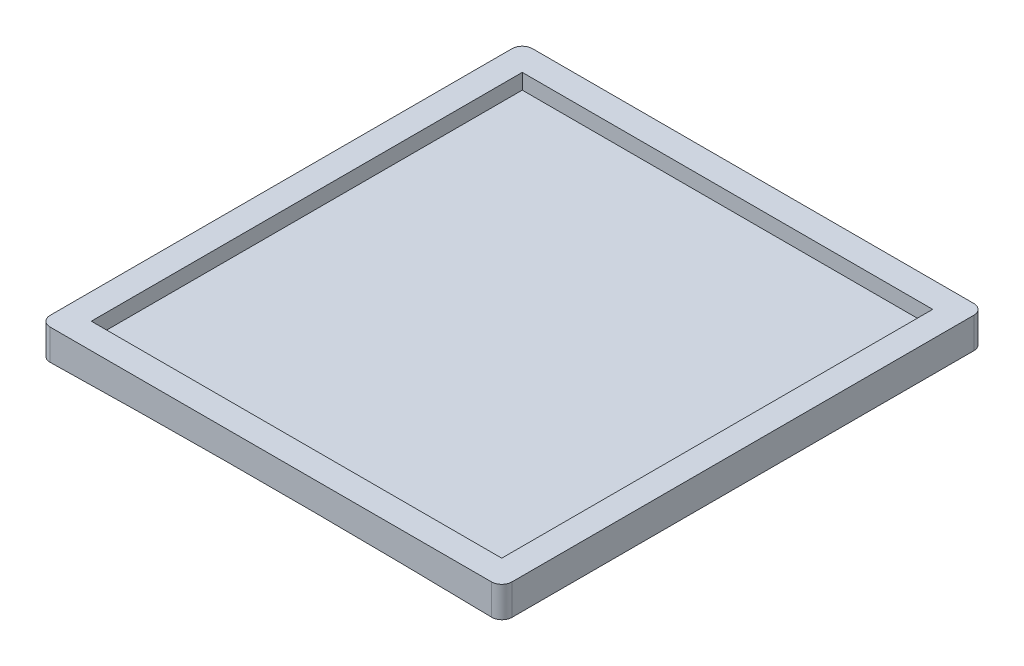
ISO-10303-21;
HEADER;
FILE_DESCRIPTION(('STEP AP214'),'2;1');
FILE_NAME('part.step','',(''),(''),'','','');
FILE_SCHEMA(('AUTOMOTIVE_DESIGN { 1 0 10303 214 1 1 1 1 }'));
ENDSEC;
DATA;
#1=APPLICATION_CONTEXT('core data for automotive mechanical design processes');
#2=APPLICATION_PROTOCOL_DEFINITION('international standard','automotive_design',2000,#1);
#3=PRODUCT_CONTEXT('',#1,'mechanical');
#4=PRODUCT('Part','Part','',(#3));
#5=PRODUCT_RELATED_PRODUCT_CATEGORY('part','',(#4));
#6=PRODUCT_DEFINITION_FORMATION('','',#4);
#7=PRODUCT_DEFINITION_CONTEXT('part definition',#1,'design');
#8=PRODUCT_DEFINITION('design','',#6,#7);
#9=PRODUCT_DEFINITION_SHAPE('','',#8);
#10=(LENGTH_UNIT() NAMED_UNIT(*) SI_UNIT(.MILLI.,.METRE.));
#11=(NAMED_UNIT(*) PLANE_ANGLE_UNIT() SI_UNIT($,.RADIAN.));
#12=(NAMED_UNIT(*) SI_UNIT($,.STERADIAN.) SOLID_ANGLE_UNIT());
#13=UNCERTAINTY_MEASURE_WITH_UNIT(LENGTH_MEASURE(1.E-05),#10,'distance_accuracy_value','');
#14=(GEOMETRIC_REPRESENTATION_CONTEXT(3) GLOBAL_UNCERTAINTY_ASSIGNED_CONTEXT((#13)) GLOBAL_UNIT_ASSIGNED_CONTEXT((#10,
#11,#12)) REPRESENTATION_CONTEXT('',''));
#15=CARTESIAN_POINT('',(0.,0.,0.));
#16=DIRECTION('',(0.,0.,1.));
#17=DIRECTION('',(1.,0.,0.));
#18=AXIS2_PLACEMENT_3D('',#15,#16,#17);
#19=CARTESIAN_POINT('',(-21.5,-3.,-22.5));
#20=DIRECTION('',(0.,1.,0.));
#21=DIRECTION('',(0.,0.,1.));
#22=AXIS2_PLACEMENT_3D('',#19,#20,#21);
#23=CYLINDRICAL_SURFACE('',#22,1.);
#24=CARTESIAN_POINT('',(-22.5,-3.00000000000011,-22.5));
#25=CARTESIAN_POINT('',(-22.4999998166428,-3.00000000270784,-22.5281297686401));
#26=CARTESIAN_POINT('',(-22.4988123292283,-2.9999736033164,-22.5562460591101));
#27=CARTESIAN_POINT('',(-22.4940749837666,-2.99986832995511,-22.6122774040177));
#28=CARTESIAN_POINT('',(-22.4905252402469,-2.99978945852922,-22.6401924681447));
#29=CARTESIAN_POINT('',(-22.4763664576325,-2.99947497435213,-22.7232866753169));
#30=CARTESIAN_POINT('',(-22.4622477722973,-2.99916148924938,-22.7779091536586));
#31=CARTESIAN_POINT('',(-22.4250434081848,-2.99833669960991,-22.884006252574));
#32=CARTESIAN_POINT('',(-22.4019534473158,-2.9978253006071,-22.9354793563148));
#33=CARTESIAN_POINT('',(-22.347465046526,-2.99662104741549,-23.0338167461085));
#34=CARTESIAN_POINT('',(-22.3160680532846,-2.99592822482204,-23.0806818327058));
#35=CARTESIAN_POINT('',(-22.2458530056798,-2.99438290058622,-23.1684789278725));
#36=CARTESIAN_POINT('',(-22.2070341907,-2.99353038257784,-23.2094103275787));
#37=CARTESIAN_POINT('',(-22.1230694959934,-2.99169206741586,-23.2841840559463));
#38=CARTESIAN_POINT('',(-22.0779223767175,-2.99070624415258,-23.3180249925241));
#39=CARTESIAN_POINT('',(-21.9825748121303,-2.98863141221531,-23.3776594457395));
#40=CARTESIAN_POINT('',(-21.9323722197243,-2.98754235971077,-23.4034495238945));
#41=CARTESIAN_POINT('',(-21.8283610536926,-2.9852944138296,-23.4462220391869));
#42=CARTESIAN_POINT('',(-21.7745546017324,-2.98413556158529,-23.4632096079587));
#43=CARTESIAN_POINT('',(-21.6836834807763,-2.98218601949016,-23.4836814365146));
#44=CARTESIAN_POINT('',(-21.6471896934477,-2.98140502882274,-23.4897971895579));
#45=CARTESIAN_POINT('',(-21.573802377041,-2.97983849695989,-23.4979559396423));
#46=CARTESIAN_POINT('',(-21.536909489191,-2.97905296380111,-23.5000047077338));
#47=CARTESIAN_POINT('',(-21.5,-2.97826915531761,-23.5));
#48=B_SPLINE_CURVE_WITH_KNOTS('',3,(#24,#25,#26,#27,#28,#29,#30,#31,#32,#33,#34,#35,#36,#37,#38,
#39,#40,#41,#42,#43,#44,#45,#46,#47),.UNSPECIFIED.,.F.,.F.,(4,2,2,2,2,2,2,2,2,2,2,4),(0.,
0.0843374654861998,0.168670842398708,0.337058236653876,0.505526103054506,0.673964649864625,
0.84242046815518,1.01090932875864,1.17947005199277,1.34793239783123,1.45875415132344,
1.56941853604758),.UNSPECIFIED.);
#49=CARTESIAN_POINT('',(-22.5,-3.,-22.5));
#50=VERTEX_POINT('',#49);
#51=CARTESIAN_POINT('',(-21.5,-2.97826915531774,-23.5));
#52=VERTEX_POINT('',#51);
#53=EDGE_CURVE('E145',#50,#52,#48,.T.);
#54=ORIENTED_EDGE('',*,*,#53,.F.);
#55=DIRECTION('',(0.,1.,0.));
#56=VECTOR('',#55,1.);
#57=CARTESIAN_POINT('',(-22.5,-3.,-22.5));
#58=LINE('',#57,#56);
#59=CARTESIAN_POINT('',(-22.5,0.,-22.5));
#60=VERTEX_POINT('',#59);
#61=EDGE_CURVE('E42',#50,#60,#58,.T.);
#62=ORIENTED_EDGE('',*,*,#61,.T.);
#63=CARTESIAN_POINT('',(-21.5,0.,-22.5));
#64=DIRECTION('',(0.,1.,0.));
#65=DIRECTION('',(0.,0.,1.));
#66=AXIS2_PLACEMENT_3D('',#63,#64,#65);
#67=CIRCLE('',#66,1.);
#68=CARTESIAN_POINT('',(-21.5,0.,-23.5));
#69=VERTEX_POINT('',#68);
#70=EDGE_CURVE('E142',#69,#60,#67,.T.);
#71=ORIENTED_EDGE('',*,*,#70,.F.);
#72=DIRECTION('',(0.,1.,0.));
#73=VECTOR('',#72,1.);
#74=CARTESIAN_POINT('',(-21.5,-3.,-23.5));
#75=LINE('',#74,#73);
#76=EDGE_CURVE('E11',#52,#69,#75,.T.);
#77=ORIENTED_EDGE('',*,*,#76,.F.);
#78=EDGE_LOOP('',(#54,#62,#71,#77));
#79=FACE_BOUND('',#78,.T.);
#80=ADVANCED_FACE('F38',(#79),#23,.T.);
#81=CARTESIAN_POINT('',(21.5,-3.,-23.5));
#82=DIRECTION('',(0.,0.,-1.));
#83=DIRECTION('',(-1.,0.,0.));
#84=AXIS2_PLACEMENT_3D('',#81,#82,#83);
#85=PLANE('',#84);
#86=CARTESIAN_POINT('',(0.,-1015.375,-23.5));
#87=DIRECTION('',(0.,0.,1.));
#88=DIRECTION('',(-1.,0.,0.));
#89=AXIS2_PLACEMENT_3D('',#86,#87,#88);
#90=CIRCLE('',#89,1012.625);
#91=CARTESIAN_POINT('',(21.5,-2.97826915531774,-23.5));
#92=VERTEX_POINT('',#91);
#93=EDGE_CURVE('E199',#92,#52,#90,.T.);
#94=ORIENTED_EDGE('',*,*,#93,.T.);
#95=ORIENTED_EDGE('',*,*,#76,.T.);
#96=DIRECTION('',(-1.,0.,0.));
#97=VECTOR('',#96,1.);
#98=CARTESIAN_POINT('',(21.5,0.,-23.5));
#99=LINE('',#98,#97);
#100=CARTESIAN_POINT('',(21.5,0.,-23.5));
#101=VERTEX_POINT('',#100);
#102=EDGE_CURVE('E107',#101,#69,#99,.T.);
#103=ORIENTED_EDGE('',*,*,#102,.F.);
#104=DIRECTION('',(0.,1.,0.));
#105=VECTOR('',#104,1.);
#106=CARTESIAN_POINT('',(21.5,-3.,-23.5));
#107=LINE('',#106,#105);
#108=EDGE_CURVE('E47',#92,#101,#107,.T.);
#109=ORIENTED_EDGE('',*,*,#108,.F.);
#110=EDGE_LOOP('',(#94,#95,#103,#109));
#111=FACE_BOUND('',#110,.T.);
#112=ADVANCED_FACE('F112',(#111),#85,.T.);
#113=CARTESIAN_POINT('',(21.5,-3.,-22.5));
#114=DIRECTION('',(0.,1.,0.));
#115=DIRECTION('',(0.,0.,1.));
#116=AXIS2_PLACEMENT_3D('',#113,#114,#115);
#117=CYLINDRICAL_SURFACE('',#116,1.);
#118=CARTESIAN_POINT('',(21.5,-2.97826915531774,-23.5));
#119=CARTESIAN_POINT('',(21.5281397384484,-2.97886674488036,-23.4999998094529));
#120=CARTESIAN_POINT('',(21.556265971144,-2.97946523602505,-23.4988114878802));
#121=CARTESIAN_POINT('',(21.6123171495552,-2.98066025073264,-23.4940707794244));
#122=CARTESIAN_POINT('',(21.6402421047893,-2.98125677438784,-23.4905185050863));
#123=CARTESIAN_POINT('',(21.723366541319,-2.98303587332827,-23.4763494134619));
#124=CARTESIAN_POINT('',(21.7780091956297,-2.98420996484127,-23.4622202344602));
#125=CARTESIAN_POINT('',(21.8841457376455,-2.98649867360611,-23.4249869214508));
#126=CARTESIAN_POINT('',(21.9356380943169,-2.98761326190661,-23.4018784630242));
#127=CARTESIAN_POINT('',(22.0340111023056,-2.989749514461,-23.3473443461915));
#128=CARTESIAN_POINT('',(22.0808925715952,-2.99077119519429,-23.3159201666594));
#129=CARTESIAN_POINT('',(22.1687082772654,-2.99269033062502,-23.2456488258569));
#130=CARTESIAN_POINT('',(22.2096431202197,-2.99358779799216,-23.2068024226127));
#131=CARTESIAN_POINT('',(22.2844185483418,-2.99523098180366,-23.1227763566933));
#132=CARTESIAN_POINT('',(22.3182577476355,-2.99597666860242,-23.0775954596767));
#133=CARTESIAN_POINT('',(22.3778672375611,-2.99729253352031,-22.9821969891199));
#134=CARTESIAN_POINT('',(22.4036377276314,-2.99786271597746,-22.9319795401113));
#135=CARTESIAN_POINT('',(22.4463686698106,-2.99880923978894,-22.8279390963763));
#136=CARTESIAN_POINT('',(22.4633343130276,-2.99918569535848,-22.7741182473027));
#137=CARTESIAN_POINT('',(22.483749029976,-2.99963892105321,-22.683305600383));
#138=CARTESIAN_POINT('',(22.4898394604557,-2.99977421935298,-22.6468859548112));
#139=CARTESIAN_POINT('',(22.4979644022819,-2.99995475863437,-22.5736493058944));
#140=CARTESIAN_POINT('',(22.5000046630941,-3.00000012727654,-22.5368329405243));
#141=CARTESIAN_POINT('',(22.5,-3.00000000000002,-22.5));
#142=B_SPLINE_CURVE_WITH_KNOTS('',3,(#118,#119,#120,#121,#122,#123,#124,#125,#126,#127,#128,
#129,#130,#131,#132,#133,#134,#135,#136,#137,#138,#139,#140,#141),.UNSPECIFIED.,.F.,.F.,(4,2,2,
2,2,2,2,2,2,2,2,4),(0.,0.084386388410552,0.1687687595723,0.337256206555704,0.505824897823964,
0.674363630832252,0.842885160292792,1.01143957366298,1.17998982045571,1.34844058120525,
1.45900770651651,1.56941776240998),.UNSPECIFIED.);
#143=CARTESIAN_POINT('',(22.5,-3.,-22.5));
#144=VERTEX_POINT('',#143);
#145=EDGE_CURVE('E64',#92,#144,#142,.T.);
#146=ORIENTED_EDGE('',*,*,#145,.F.);
#147=ORIENTED_EDGE('',*,*,#108,.T.);
#148=CARTESIAN_POINT('',(21.5,0.,-22.5));
#149=DIRECTION('',(0.,1.,0.));
#150=DIRECTION('',(0.,0.,-1.));
#151=AXIS2_PLACEMENT_3D('',#148,#149,#150);
#152=CIRCLE('',#151,1.);
#153=CARTESIAN_POINT('',(22.5,0.,-22.5));
#154=VERTEX_POINT('',#153);
#155=EDGE_CURVE('E95',#154,#101,#152,.T.);
#156=ORIENTED_EDGE('',*,*,#155,.F.);
#157=DIRECTION('',(0.,1.,0.));
#158=VECTOR('',#157,1.);
#159=CARTESIAN_POINT('',(22.5,-3.,-22.5));
#160=LINE('',#159,#158);
#161=EDGE_CURVE('E101',#144,#154,#160,.T.);
#162=ORIENTED_EDGE('',*,*,#161,.F.);
#163=EDGE_LOOP('',(#146,#147,#156,#162));
#164=FACE_BOUND('',#163,.T.);
#165=ADVANCED_FACE('F94',(#164),#117,.T.);
#166=CARTESIAN_POINT('',(22.5,-3.,-22.5));
#167=DIRECTION('',(1.,0.,0.));
#168=DIRECTION('',(0.,0.,-1.));
#169=AXIS2_PLACEMENT_3D('',#166,#167,#168);
#170=PLANE('',#169);
#171=DIRECTION('',(0.,0.,-1.));
#172=VECTOR('',#171,1.);
#173=CARTESIAN_POINT('',(22.5,0.,-22.5));
#174=LINE('',#173,#172);
#175=CARTESIAN_POINT('',(22.5,0.,22.5));
#176=VERTEX_POINT('',#175);
#177=EDGE_CURVE('E110',#176,#154,#174,.T.);
#178=ORIENTED_EDGE('',*,*,#177,.F.);
#179=DIRECTION('',(0.,1.,0.));
#180=VECTOR('',#179,1.);
#181=CARTESIAN_POINT('',(22.5,-3.,22.5));
#182=LINE('',#181,#180);
#183=CARTESIAN_POINT('',(22.5,-3.,22.5));
#184=VERTEX_POINT('',#183);
#185=EDGE_CURVE('E123',#184,#176,#182,.T.);
#186=ORIENTED_EDGE('',*,*,#185,.F.);
#187=DIRECTION('',(0.,0.,-1.));
#188=VECTOR('',#187,1.);
#189=CARTESIAN_POINT('',(22.5,-3.,-22.5));
#190=LINE('',#189,#188);
#191=EDGE_CURVE('E118',#184,#144,#190,.T.);
#192=ORIENTED_EDGE('',*,*,#191,.T.);
#193=ORIENTED_EDGE('',*,*,#161,.T.);
#194=EDGE_LOOP('',(#178,#186,#192,#193));
#195=FACE_BOUND('',#194,.T.);
#196=ADVANCED_FACE('F164',(#195),#170,.T.);
#197=CARTESIAN_POINT('',(21.5,-3.,22.5));
#198=DIRECTION('',(0.,1.,0.));
#199=DIRECTION('',(0.,0.,1.));
#200=AXIS2_PLACEMENT_3D('',#197,#198,#199);
#201=CYLINDRICAL_SURFACE('',#200,1.);
#202=CARTESIAN_POINT('',(22.5,-3.00000000000011,22.5));
#203=CARTESIAN_POINT('',(22.4999998166428,-3.00000000270784,22.5281297686401));
#204=CARTESIAN_POINT('',(22.4988123292283,-2.9999736033164,22.5562460591101));
#205=CARTESIAN_POINT('',(22.4940749837666,-2.99986832995511,22.6122774040177));
#206=CARTESIAN_POINT('',(22.4905252402469,-2.99978945852922,22.6401924681447));
#207=CARTESIAN_POINT('',(22.4763664576325,-2.99947497435213,22.7232866753169));
#208=CARTESIAN_POINT('',(22.4622477722974,-2.99916148924938,22.7779091536586));
#209=CARTESIAN_POINT('',(22.4250434081848,-2.99833669960991,22.884006252574));
#210=CARTESIAN_POINT('',(22.4019534473158,-2.9978253006071,22.9354793563148));
#211=CARTESIAN_POINT('',(22.347465046526,-2.99662104741549,23.0338167461085));
#212=CARTESIAN_POINT('',(22.3160680532846,-2.99592822482204,23.0806818327058));
#213=CARTESIAN_POINT('',(22.2458530056798,-2.99438290058622,23.1684789278725));
#214=CARTESIAN_POINT('',(22.2070341907,-2.99353038257784,23.2094103275787));
#215=CARTESIAN_POINT('',(22.1230694959934,-2.99169206741586,23.2841840559463));
#216=CARTESIAN_POINT('',(22.0779223767176,-2.99070624415258,23.3180249925241));
#217=CARTESIAN_POINT('',(21.9825748121303,-2.98863141221531,23.3776594457395));
#218=CARTESIAN_POINT('',(21.9323722197243,-2.98754235971077,23.4034495238945));
#219=CARTESIAN_POINT('',(21.8283610536926,-2.9852944138296,23.4462220391869));
#220=CARTESIAN_POINT('',(21.7745546017324,-2.98413556158529,23.4632096079587));
#221=CARTESIAN_POINT('',(21.6836834807764,-2.98218601949016,23.4836814365146));
#222=CARTESIAN_POINT('',(21.6471896934477,-2.98140502882274,23.4897971895579));
#223=CARTESIAN_POINT('',(21.573802377041,-2.97983849695989,23.4979559396423));
#224=CARTESIAN_POINT('',(21.536909489191,-2.97905296380111,23.5000047077338));
#225=CARTESIAN_POINT('',(21.5,-2.97826915531761,23.5));
#226=B_SPLINE_CURVE_WITH_KNOTS('',3,(#202,#203,#204,#205,#206,#207,#208,#209,#210,#211,#212,
#213,#214,#215,#216,#217,#218,#219,#220,#221,#222,#223,#224,#225),.UNSPECIFIED.,.F.,.F.,(4,2,2,
2,2,2,2,2,2,2,2,4),(0.,0.0843374654861998,0.168670842398708,0.337058236653876,0.505526103054506,
0.673964649864625,0.84242046815518,1.01090932875864,1.17947005199277,1.34793239783123,
1.45875415132344,1.56941853604758),.UNSPECIFIED.);
#227=CARTESIAN_POINT('',(21.5,-2.97826915531774,23.5));
#228=VERTEX_POINT('',#227);
#229=EDGE_CURVE('E163',#184,#228,#226,.T.);
#230=ORIENTED_EDGE('',*,*,#229,.F.);
#231=ORIENTED_EDGE('',*,*,#185,.T.);
#232=CARTESIAN_POINT('',(21.5,0.,22.5));
#233=DIRECTION('',(0.,1.,0.));
#234=DIRECTION('',(0.,0.,-1.));
#235=AXIS2_PLACEMENT_3D('',#232,#233,#234);
#236=CIRCLE('',#235,1.);
#237=CARTESIAN_POINT('',(21.5,0.,23.5));
#238=VERTEX_POINT('',#237);
#239=EDGE_CURVE('E154',#238,#176,#236,.T.);
#240=ORIENTED_EDGE('',*,*,#239,.F.);
#241=DIRECTION('',(0.,1.,0.));
#242=VECTOR('',#241,1.);
#243=CARTESIAN_POINT('',(21.5,-3.,23.5));
#244=LINE('',#243,#242);
#245=EDGE_CURVE('E125',#228,#238,#244,.T.);
#246=ORIENTED_EDGE('',*,*,#245,.F.);
#247=EDGE_LOOP('',(#230,#231,#240,#246));
#248=FACE_BOUND('',#247,.T.);
#249=ADVANCED_FACE('F160',(#248),#201,.T.);
#250=CARTESIAN_POINT('',(21.5,-3.,23.5));
#251=DIRECTION('',(0.,0.,1.));
#252=DIRECTION('',(1.,0.,0.));
#253=AXIS2_PLACEMENT_3D('',#250,#251,#252);
#254=PLANE('',#253);
#255=CARTESIAN_POINT('',(0.,-1015.375,23.5));
#256=DIRECTION('',(0.,0.,1.));
#257=DIRECTION('',(-1.,0.,0.));
#258=AXIS2_PLACEMENT_3D('',#255,#256,#257);
#259=CIRCLE('',#258,1012.625);
#260=CARTESIAN_POINT('',(-21.5,-2.97826915531774,23.5));
#261=VERTEX_POINT('',#260);
#262=EDGE_CURVE('E196',#228,#261,#259,.T.);
#263=ORIENTED_EDGE('',*,*,#262,.F.);
#264=ORIENTED_EDGE('',*,*,#245,.T.);
#265=DIRECTION('',(1.,0.,0.));
#266=VECTOR('',#265,1.);
#267=CARTESIAN_POINT('',(21.5,0.,23.5));
#268=LINE('',#267,#266);
#269=CARTESIAN_POINT('',(-21.5,0.,23.5));
#270=VERTEX_POINT('',#269);
#271=EDGE_CURVE('E151',#270,#238,#268,.T.);
#272=ORIENTED_EDGE('',*,*,#271,.F.);
#273=DIRECTION('',(0.,1.,0.));
#274=VECTOR('',#273,1.);
#275=CARTESIAN_POINT('',(-21.5,-3.,23.5));
#276=LINE('',#275,#274);
#277=EDGE_CURVE('E127',#261,#270,#276,.T.);
#278=ORIENTED_EDGE('',*,*,#277,.F.);
#279=EDGE_LOOP('',(#263,#264,#272,#278));
#280=FACE_BOUND('',#279,.T.);
#281=ADVANCED_FACE('F171',(#280),#254,.T.);
#282=CARTESIAN_POINT('',(-21.5,-3.,22.5));
#283=DIRECTION('',(0.,1.,0.));
#284=DIRECTION('',(0.,0.,1.));
#285=AXIS2_PLACEMENT_3D('',#282,#283,#284);
#286=CYLINDRICAL_SURFACE('',#285,1.);
#287=CARTESIAN_POINT('',(-21.5,-2.97826915531774,23.5));
#288=CARTESIAN_POINT('',(-21.5281397384484,-2.97886674488036,23.4999998094529));
#289=CARTESIAN_POINT('',(-21.556265971144,-2.97946523602505,23.4988114878802));
#290=CARTESIAN_POINT('',(-21.6123171495552,-2.98066025073264,23.4940707794244));
#291=CARTESIAN_POINT('',(-21.6402421047893,-2.98125677438784,23.4905185050863));
#292=CARTESIAN_POINT('',(-21.7233665413189,-2.98303587332827,23.4763494134619));
#293=CARTESIAN_POINT('',(-21.7780091956297,-2.98420996484127,23.4622202344602));
#294=CARTESIAN_POINT('',(-21.8841457376455,-2.98649867360611,23.4249869214508));
#295=CARTESIAN_POINT('',(-21.9356380943169,-2.98761326190661,23.4018784630242));
#296=CARTESIAN_POINT('',(-22.0340111023056,-2.989749514461,23.3473443461915));
#297=CARTESIAN_POINT('',(-22.0808925715952,-2.99077119519429,23.3159201666594));
#298=CARTESIAN_POINT('',(-22.1687082772654,-2.99269033062502,23.2456488258569));
#299=CARTESIAN_POINT('',(-22.2096431202197,-2.99358779799216,23.2068024226127));
#300=CARTESIAN_POINT('',(-22.2844185483418,-2.99523098180366,23.1227763566933));
#301=CARTESIAN_POINT('',(-22.3182577476355,-2.99597666860242,23.0775954596767));
#302=CARTESIAN_POINT('',(-22.377867237561,-2.99729253352031,22.9821969891199));
#303=CARTESIAN_POINT('',(-22.4036377276314,-2.99786271597746,22.9319795401113));
#304=CARTESIAN_POINT('',(-22.4463686698106,-2.99880923978894,22.8279390963763));
#305=CARTESIAN_POINT('',(-22.4633343130276,-2.99918569535848,22.7741182473027));
#306=CARTESIAN_POINT('',(-22.483749029976,-2.99963892105321,22.683305600383));
#307=CARTESIAN_POINT('',(-22.4898394604557,-2.99977421935298,22.6468859548112));
#308=CARTESIAN_POINT('',(-22.4979644022819,-2.99995475863437,22.5736493058944));
#309=CARTESIAN_POINT('',(-22.5000046630941,-3.00000012727654,22.5368329405243));
#310=CARTESIAN_POINT('',(-22.5,-3.00000000000002,22.5));
#311=B_SPLINE_CURVE_WITH_KNOTS('',3,(#287,#288,#289,#290,#291,#292,#293,#294,#295,#296,#297,
#298,#299,#300,#301,#302,#303,#304,#305,#306,#307,#308,#309,#310),.UNSPECIFIED.,.F.,.F.,(4,2,2,
2,2,2,2,2,2,2,2,4),(0.,0.084386388410552,0.1687687595723,0.337256206555704,0.505824897823964,
0.674363630832252,0.842885160292792,1.01143957366298,1.17998982045571,1.34844058120525,
1.45900770651651,1.56941776240998),.UNSPECIFIED.);
#312=CARTESIAN_POINT('',(-22.5,-3.,22.5));
#313=VERTEX_POINT('',#312);
#314=EDGE_CURVE('E192',#261,#313,#311,.T.);
#315=ORIENTED_EDGE('',*,*,#314,.F.);
#316=ORIENTED_EDGE('',*,*,#277,.T.);
#317=CARTESIAN_POINT('',(-21.5,0.,22.5));
#318=DIRECTION('',(0.,1.,0.));
#319=DIRECTION('',(0.,0.,-1.));
#320=AXIS2_PLACEMENT_3D('',#317,#318,#319);
#321=CIRCLE('',#320,1.);
#322=CARTESIAN_POINT('',(-22.5,0.,22.5));
#323=VERTEX_POINT('',#322);
#324=EDGE_CURVE('E148',#323,#270,#321,.T.);
#325=ORIENTED_EDGE('',*,*,#324,.F.);
#326=DIRECTION('',(0.,1.,0.));
#327=VECTOR('',#326,1.);
#328=CARTESIAN_POINT('',(-22.5,-3.,22.5));
#329=LINE('',#328,#327);
#330=EDGE_CURVE('E128',#313,#323,#329,.T.);
#331=ORIENTED_EDGE('',*,*,#330,.F.);
#332=EDGE_LOOP('',(#315,#316,#325,#331));
#333=FACE_BOUND('',#332,.T.);
#334=ADVANCED_FACE('F188',(#333),#286,.T.);
#335=CARTESIAN_POINT('',(-22.5,-3.,-22.5));
#336=DIRECTION('',(-1.,0.,0.));
#337=DIRECTION('',(0.,0.,1.));
#338=AXIS2_PLACEMENT_3D('',#335,#336,#337);
#339=PLANE('',#338);
#340=DIRECTION('',(0.,0.,1.));
#341=VECTOR('',#340,1.);
#342=CARTESIAN_POINT('',(-22.5,0.,-22.5));
#343=LINE('',#342,#341);
#344=EDGE_CURVE('E144',#60,#323,#343,.T.);
#345=ORIENTED_EDGE('',*,*,#344,.F.);
#346=ORIENTED_EDGE('',*,*,#61,.F.);
#347=DIRECTION('',(0.,0.,1.));
#348=VECTOR('',#347,1.);
#349=CARTESIAN_POINT('',(-22.5,-3.,-22.5));
#350=LINE('',#349,#348);
#351=EDGE_CURVE('E115',#50,#313,#350,.T.);
#352=ORIENTED_EDGE('',*,*,#351,.T.);
#353=ORIENTED_EDGE('',*,*,#330,.T.);
#354=EDGE_LOOP('',(#345,#346,#352,#353));
#355=FACE_BOUND('',#354,.T.);
#356=ADVANCED_FACE('F185',(#355),#339,.T.);
#357=CARTESIAN_POINT('',(-21.5,0.,-22.5));
#358=DIRECTION('',(0.,1.,0.));
#359=DIRECTION('',(0.,0.,1.));
#360=AXIS2_PLACEMENT_3D('',#357,#358,#359);
#361=PLANE('',#360);
#362=DIRECTION('',(0.,0.,-1.));
#363=VECTOR('',#362,1.);
#364=CARTESIAN_POINT('',(20.,0.,21.));
#365=LINE('',#364,#363);
#366=CARTESIAN_POINT('',(20.,0.,21.));
#367=VERTEX_POINT('',#366);
#368=CARTESIAN_POINT('',(20.,0.,-21.));
#369=VERTEX_POINT('',#368);
#370=EDGE_CURVE('E55',#367,#369,#365,.T.);
#371=ORIENTED_EDGE('',*,*,#370,.F.);
#372=DIRECTION('',(1.,0.,0.));
#373=VECTOR('',#372,1.);
#374=CARTESIAN_POINT('',(-20.,0.,21.));
#375=LINE('',#374,#373);
#376=CARTESIAN_POINT('',(-20.,0.,21.));
#377=VERTEX_POINT('',#376);
#378=EDGE_CURVE('E283',#377,#367,#375,.T.);
#379=ORIENTED_EDGE('',*,*,#378,.F.);
#380=DIRECTION('',(0.,0.,1.));
#381=VECTOR('',#380,1.);
#382=CARTESIAN_POINT('',(-20.,0.,21.));
#383=LINE('',#382,#381);
#384=CARTESIAN_POINT('',(-20.,0.,-21.));
#385=VERTEX_POINT('',#384);
#386=EDGE_CURVE('E286',#385,#377,#383,.T.);
#387=ORIENTED_EDGE('',*,*,#386,.F.);
#388=DIRECTION('',(-1.,0.,0.));
#389=VECTOR('',#388,1.);
#390=CARTESIAN_POINT('',(-20.,0.,-21.));
#391=LINE('',#390,#389);
#392=EDGE_CURVE('E292',#369,#385,#391,.T.);
#393=ORIENTED_EDGE('',*,*,#392,.F.);
#394=EDGE_LOOP('',(#371,#379,#387,#393));
#395=FACE_BOUND('',#394,.T.);
#396=ORIENTED_EDGE('',*,*,#70,.T.);
#397=ORIENTED_EDGE('',*,*,#344,.T.);
#398=ORIENTED_EDGE('',*,*,#324,.T.);
#399=ORIENTED_EDGE('',*,*,#271,.T.);
#400=ORIENTED_EDGE('',*,*,#239,.T.);
#401=ORIENTED_EDGE('',*,*,#177,.T.);
#402=ORIENTED_EDGE('',*,*,#155,.T.);
#403=ORIENTED_EDGE('',*,*,#102,.T.);
#404=EDGE_LOOP('',(#396,#397,#398,#399,#400,#401,#402,#403));
#405=FACE_BOUND('',#404,.T.);
#406=ADVANCED_FACE('F106',(#395,#405),#361,.T.);
#407=CARTESIAN_POINT('',(0.,-1015.375,-23.5));
#408=DIRECTION('',(0.,0.,1.));
#409=DIRECTION('',(1.,0.,0.));
#410=AXIS2_PLACEMENT_3D('',#407,#408,#409);
#411=CYLINDRICAL_SURFACE('',#410,1012.625);
#412=ORIENTED_EDGE('',*,*,#53,.T.);
#413=ORIENTED_EDGE('',*,*,#93,.F.);
#414=ORIENTED_EDGE('',*,*,#145,.T.);
#415=ORIENTED_EDGE('',*,*,#191,.F.);
#416=ORIENTED_EDGE('',*,*,#229,.T.);
#417=ORIENTED_EDGE('',*,*,#262,.T.);
#418=ORIENTED_EDGE('',*,*,#314,.T.);
#419=ORIENTED_EDGE('',*,*,#351,.F.);
#420=EDGE_LOOP('',(#412,#413,#414,#415,#416,#417,#418,#419));
#421=FACE_BOUND('',#420,.T.);
#422=ADVANCED_FACE('F223',(#421),#411,.F.);
#423=CARTESIAN_POINT('',(20.,-1.5,21.));
#424=DIRECTION('',(1.,0.,0.));
#425=DIRECTION('',(0.,0.,-1.));
#426=AXIS2_PLACEMENT_3D('',#423,#424,#425);
#427=PLANE('',#426);
#428=ORIENTED_EDGE('',*,*,#370,.T.);
#429=DIRECTION('',(0.,1.,0.));
#430=VECTOR('',#429,1.);
#431=CARTESIAN_POINT('',(20.,-1.5,-21.));
#432=LINE('',#431,#430);
#433=CARTESIAN_POINT('',(20.,-1.5,-21.));
#434=VERTEX_POINT('',#433);
#435=EDGE_CURVE('E206',#434,#369,#432,.T.);
#436=ORIENTED_EDGE('',*,*,#435,.F.);
#437=DIRECTION('',(0.,0.,-1.));
#438=VECTOR('',#437,1.);
#439=CARTESIAN_POINT('',(20.,-1.5,21.));
#440=LINE('',#439,#438);
#441=CARTESIAN_POINT('',(20.,-1.5,21.));
#442=VERTEX_POINT('',#441);
#443=EDGE_CURVE('E266',#442,#434,#440,.T.);
#444=ORIENTED_EDGE('',*,*,#443,.F.);
#445=DIRECTION('',(0.,1.,0.));
#446=VECTOR('',#445,1.);
#447=CARTESIAN_POINT('',(20.,-1.5,21.));
#448=LINE('',#447,#446);
#449=EDGE_CURVE('E200',#442,#367,#448,.T.);
#450=ORIENTED_EDGE('',*,*,#449,.T.);
#451=EDGE_LOOP('',(#428,#436,#444,#450));
#452=FACE_BOUND('',#451,.T.);
#453=ADVANCED_FACE('F228',(#452),#427,.F.);
#454=CARTESIAN_POINT('',(-20.,-1.5,21.));
#455=DIRECTION('',(0.,0.,1.));
#456=DIRECTION('',(1.,0.,0.));
#457=AXIS2_PLACEMENT_3D('',#454,#455,#456);
#458=PLANE('',#457);
#459=ORIENTED_EDGE('',*,*,#378,.T.);
#460=ORIENTED_EDGE('',*,*,#449,.F.);
#461=DIRECTION('',(1.,0.,0.));
#462=VECTOR('',#461,1.);
#463=CARTESIAN_POINT('',(-20.,-1.5,21.));
#464=LINE('',#463,#462);
#465=CARTESIAN_POINT('',(-20.,-1.5,21.));
#466=VERTEX_POINT('',#465);
#467=EDGE_CURVE('E272',#466,#442,#464,.T.);
#468=ORIENTED_EDGE('',*,*,#467,.F.);
#469=DIRECTION('',(0.,1.,0.));
#470=VECTOR('',#469,1.);
#471=CARTESIAN_POINT('',(-20.,-1.5,21.));
#472=LINE('',#471,#470);
#473=EDGE_CURVE('E203',#466,#377,#472,.T.);
#474=ORIENTED_EDGE('',*,*,#473,.T.);
#475=EDGE_LOOP('',(#459,#460,#468,#474));
#476=FACE_BOUND('',#475,.T.);
#477=ADVANCED_FACE('F302',(#476),#458,.F.);
#478=CARTESIAN_POINT('',(-20.,-1.5,21.));
#479=DIRECTION('',(-1.,0.,0.));
#480=DIRECTION('',(0.,0.,1.));
#481=AXIS2_PLACEMENT_3D('',#478,#479,#480);
#482=PLANE('',#481);
#483=ORIENTED_EDGE('',*,*,#386,.T.);
#484=ORIENTED_EDGE('',*,*,#473,.F.);
#485=DIRECTION('',(0.,0.,1.));
#486=VECTOR('',#485,1.);
#487=CARTESIAN_POINT('',(-20.,-1.5,21.));
#488=LINE('',#487,#486);
#489=CARTESIAN_POINT('',(-20.,-1.5,-21.));
#490=VERTEX_POINT('',#489);
#491=EDGE_CURVE('E279',#490,#466,#488,.T.);
#492=ORIENTED_EDGE('',*,*,#491,.F.);
#493=DIRECTION('',(0.,1.,0.));
#494=VECTOR('',#493,1.);
#495=CARTESIAN_POINT('',(-20.,-1.5,-21.));
#496=LINE('',#495,#494);
#497=EDGE_CURVE('E271',#490,#385,#496,.T.);
#498=ORIENTED_EDGE('',*,*,#497,.T.);
#499=EDGE_LOOP('',(#483,#484,#492,#498));
#500=FACE_BOUND('',#499,.T.);
#501=ADVANCED_FACE('F297',(#500),#482,.F.);
#502=CARTESIAN_POINT('',(-20.,-1.5,-21.));
#503=DIRECTION('',(0.,0.,-1.));
#504=DIRECTION('',(-1.,0.,0.));
#505=AXIS2_PLACEMENT_3D('',#502,#503,#504);
#506=PLANE('',#505);
#507=ORIENTED_EDGE('',*,*,#392,.T.);
#508=ORIENTED_EDGE('',*,*,#497,.F.);
#509=DIRECTION('',(-1.,0.,0.));
#510=VECTOR('',#509,1.);
#511=CARTESIAN_POINT('',(-20.,-1.5,-21.));
#512=LINE('',#511,#510);
#513=EDGE_CURVE('E274',#434,#490,#512,.T.);
#514=ORIENTED_EDGE('',*,*,#513,.F.);
#515=ORIENTED_EDGE('',*,*,#435,.T.);
#516=EDGE_LOOP('',(#507,#508,#514,#515));
#517=FACE_BOUND('',#516,.T.);
#518=ADVANCED_FACE('F275',(#517),#506,.F.);
#519=CARTESIAN_POINT('',(0.,-1.5,0.));
#520=DIRECTION('',(0.,-1.,0.));
#521=DIRECTION('',(0.,0.,-1.));
#522=AXIS2_PLACEMENT_3D('',#519,#520,#521);
#523=PLANE('',#522);
#524=ORIENTED_EDGE('',*,*,#443,.T.);
#525=ORIENTED_EDGE('',*,*,#513,.T.);
#526=ORIENTED_EDGE('',*,*,#491,.T.);
#527=ORIENTED_EDGE('',*,*,#467,.T.);
#528=EDGE_LOOP('',(#524,#525,#526,#527));
#529=FACE_BOUND('',#528,.T.);
#530=ADVANCED_FACE('F281',(#529),#523,.F.);
#531=CLOSED_SHELL('',(#80,#112,#165,#196,#249,#281,#334,#356,#406,#422,#453,#477,#501,#518,#530));
#532=MANIFOLD_SOLID_BREP('B2',#531);
#533=ADVANCED_BREP_SHAPE_REPRESENTATION('',(#18,#532),#14);
#534=SHAPE_DEFINITION_REPRESENTATION(#9,#533);
ENDSEC;
END-ISO-10303-21;
